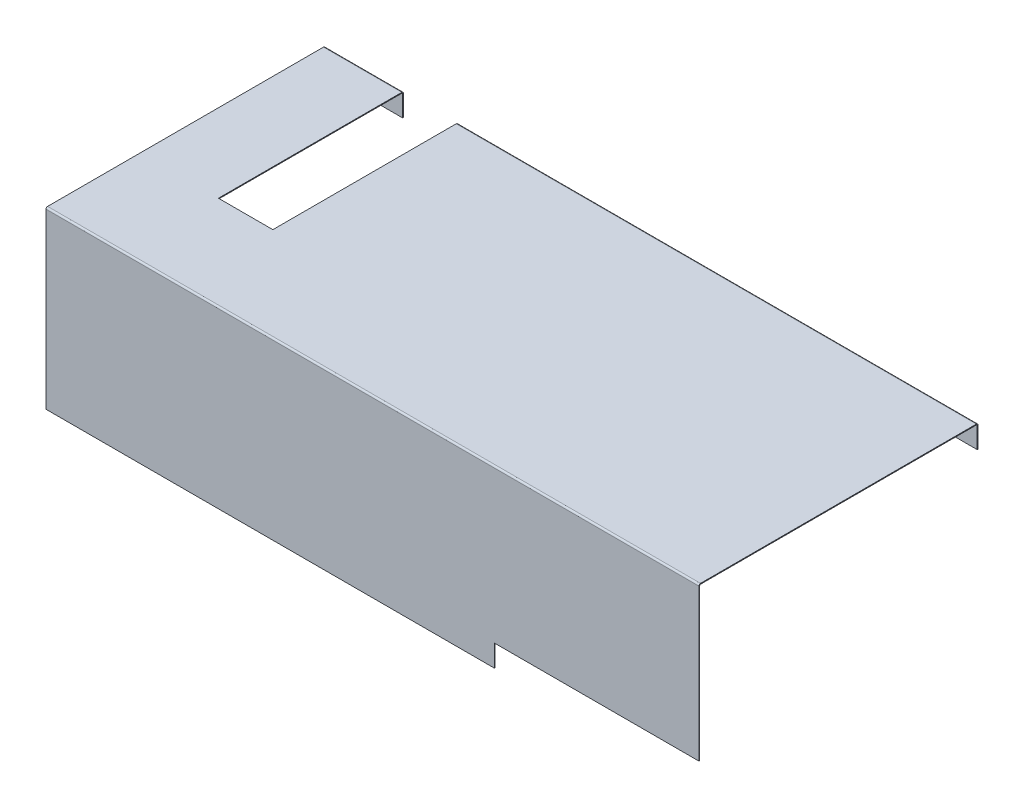
ISO-10303-21;
HEADER;
FILE_DESCRIPTION(('STEP AP214'),'2;1');
FILE_NAME('part.step','',(''),(''),'','','');
FILE_SCHEMA(('AUTOMOTIVE_DESIGN { 1 0 10303 214 1 1 1 1 }'));
ENDSEC;
DATA;
#1=APPLICATION_CONTEXT('core data for automotive mechanical design processes');
#2=APPLICATION_PROTOCOL_DEFINITION('international standard','automotive_design',2000,#1);
#3=PRODUCT_CONTEXT('',#1,'mechanical');
#4=PRODUCT('Part','Part','',(#3));
#5=PRODUCT_RELATED_PRODUCT_CATEGORY('part','',(#4));
#6=PRODUCT_DEFINITION_FORMATION('','',#4);
#7=PRODUCT_DEFINITION_CONTEXT('part definition',#1,'design');
#8=PRODUCT_DEFINITION('design','',#6,#7);
#9=PRODUCT_DEFINITION_SHAPE('','',#8);
#10=(LENGTH_UNIT() NAMED_UNIT(*) SI_UNIT(.MILLI.,.METRE.));
#11=(NAMED_UNIT(*) PLANE_ANGLE_UNIT() SI_UNIT($,.RADIAN.));
#12=(NAMED_UNIT(*) SI_UNIT($,.STERADIAN.) SOLID_ANGLE_UNIT());
#13=UNCERTAINTY_MEASURE_WITH_UNIT(LENGTH_MEASURE(1.E-05),#10,'distance_accuracy_value','');
#14=(GEOMETRIC_REPRESENTATION_CONTEXT(3) GLOBAL_UNCERTAINTY_ASSIGNED_CONTEXT((#13)) GLOBAL_UNIT_ASSIGNED_CONTEXT((#10,
#11,#12)) REPRESENTATION_CONTEXT('',''));
#15=CARTESIAN_POINT('',(0.,0.,0.));
#16=DIRECTION('',(0.,0.,1.));
#17=DIRECTION('',(1.,0.,0.));
#18=AXIS2_PLACEMENT_3D('',#15,#16,#17);
#19=CARTESIAN_POINT('',(122.,-20.,-255.7366));
#20=DIRECTION('',(1.,0.,0.));
#21=DIRECTION('',(0.,0.,-1.));
#22=AXIS2_PLACEMENT_3D('',#19,#20,#21);
#23=PLANE('',#22);
#24=DIRECTION('',(0.,-1.,0.));
#25=VECTOR('',#24,1.);
#26=CARTESIAN_POINT('',(122.,140.,-255.));
#27=LINE('',#26,#25);
#28=CARTESIAN_POINT('',(122.,139.2634,-255.));
#29=VERTEX_POINT('',#28);
#30=CARTESIAN_POINT('',(122.,120.,-255.));
#31=VERTEX_POINT('',#30);
#32=EDGE_CURVE('E226',#29,#31,#27,.T.);
#33=ORIENTED_EDGE('',*,*,#32,.F.);
#34=DIRECTION('',(0.,0.,-1.));
#35=VECTOR('',#34,1.);
#36=CARTESIAN_POINT('',(122.,139.2634,-255.));
#37=LINE('',#36,#35);
#38=CARTESIAN_POINT('',(122.,139.2634,-255.7366));
#39=VERTEX_POINT('',#38);
#40=EDGE_CURVE('E11',#29,#39,#37,.T.);
#41=ORIENTED_EDGE('',*,*,#40,.T.);
#42=DIRECTION('',(0.,1.,0.));
#43=VECTOR('',#42,1.);
#44=CARTESIAN_POINT('',(122.,-20.,-255.7366));
#45=LINE('',#44,#43);
#46=CARTESIAN_POINT('',(122.,120.,-255.7366));
#47=VERTEX_POINT('',#46);
#48=EDGE_CURVE('E220',#47,#39,#45,.T.);
#49=ORIENTED_EDGE('',*,*,#48,.F.);
#50=DIRECTION('',(0.,0.,1.));
#51=VECTOR('',#50,1.);
#52=CARTESIAN_POINT('',(122.,120.,-255.7366));
#53=LINE('',#52,#51);
#54=EDGE_CURVE('E229',#47,#31,#53,.T.);
#55=ORIENTED_EDGE('',*,*,#54,.T.);
#56=EDGE_LOOP('',(#33,#41,#49,#55));
#57=FACE_BOUND('',#56,.T.);
#58=ADVANCED_FACE('F39',(#57),#23,.F.);
#59=DIRECTION('',(0.,0.,-1.));
#60=VECTOR('',#59,1.);
#61=CARTESIAN_POINT('',(122.,140.7366,-255.7366));
#62=LINE('',#61,#60);
#63=CARTESIAN_POINT('',(122.,140.7366,-85.7366));
#64=VERTEX_POINT('',#63);
#65=CARTESIAN_POINT('',(122.,140.7366,-254.2634));
#66=VERTEX_POINT('',#65);
#67=EDGE_CURVE('E200',#64,#66,#62,.T.);
#68=ORIENTED_EDGE('',*,*,#67,.T.);
#69=DIRECTION('',(0.,-1.,0.));
#70=VECTOR('',#69,1.);
#71=CARTESIAN_POINT('',(122.,140.7366,-254.2634));
#72=LINE('',#71,#70);
#73=CARTESIAN_POINT('',(122.,140.,-254.2634));
#74=VERTEX_POINT('',#73);
#75=EDGE_CURVE('E47',#66,#74,#72,.T.);
#76=ORIENTED_EDGE('',*,*,#75,.T.);
#77=DIRECTION('',(0.,0.,-1.));
#78=VECTOR('',#77,1.);
#79=CARTESIAN_POINT('',(122.,140.,0.));
#80=LINE('',#79,#78);
#81=CARTESIAN_POINT('',(122.,140.,-85.7366));
#82=VERTEX_POINT('',#81);
#83=EDGE_CURVE('E219',#82,#74,#80,.T.);
#84=ORIENTED_EDGE('',*,*,#83,.F.);
#85=DIRECTION('',(0.,1.,0.));
#86=VECTOR('',#85,1.);
#87=CARTESIAN_POINT('',(122.,-20.,-85.7366));
#88=LINE('',#87,#86);
#89=EDGE_CURVE('E199',#82,#64,#88,.T.);
#90=ORIENTED_EDGE('',*,*,#89,.T.);
#91=EDGE_LOOP('',(#68,#76,#84,#90));
#92=FACE_BOUND('',#91,.T.);
#93=ADVANCED_FACE('F394',(#92),#23,.F.);
#94=CARTESIAN_POINT('',(72.,-20.,-255.7366));
#95=DIRECTION('',(-1.,0.,0.));
#96=DIRECTION('',(0.,0.,1.));
#97=AXIS2_PLACEMENT_3D('',#94,#95,#96);
#98=PLANE('',#97);
#99=DIRECTION('',(0.,0.,1.));
#100=VECTOR('',#99,1.);
#101=CARTESIAN_POINT('',(72.0000000000001,140.,2.15513881250766E-13));
#102=LINE('',#101,#100);
#103=CARTESIAN_POINT('',(72.,140.,-254.2634));
#104=VERTEX_POINT('',#103);
#105=CARTESIAN_POINT('',(72.,140.,-85.7366));
#106=VERTEX_POINT('',#105);
#107=EDGE_CURVE('E233',#104,#106,#102,.T.);
#108=ORIENTED_EDGE('',*,*,#107,.F.);
#109=DIRECTION('',(0.,1.,0.));
#110=VECTOR('',#109,1.);
#111=CARTESIAN_POINT('',(72.,140.,-254.2634));
#112=LINE('',#111,#110);
#113=CARTESIAN_POINT('',(72.,140.7366,-254.2634));
#114=VERTEX_POINT('',#113);
#115=EDGE_CURVE('E205',#104,#114,#112,.T.);
#116=ORIENTED_EDGE('',*,*,#115,.T.);
#117=DIRECTION('',(0.,0.,1.));
#118=VECTOR('',#117,1.);
#119=CARTESIAN_POINT('',(72.,140.7366,-255.7366));
#120=LINE('',#119,#118);
#121=CARTESIAN_POINT('',(72.,140.7366,-85.7366));
#122=VERTEX_POINT('',#121);
#123=EDGE_CURVE('E203',#114,#122,#120,.T.);
#124=ORIENTED_EDGE('',*,*,#123,.T.);
#125=DIRECTION('',(0.,1.,0.));
#126=VECTOR('',#125,1.);
#127=CARTESIAN_POINT('',(72.,-20.,-85.7366));
#128=LINE('',#127,#126);
#129=EDGE_CURVE('E187',#106,#122,#128,.T.);
#130=ORIENTED_EDGE('',*,*,#129,.F.);
#131=EDGE_LOOP('',(#108,#116,#124,#130));
#132=FACE_BOUND('',#131,.T.);
#133=ADVANCED_FACE('F204',(#132),#98,.F.);
#134=DIRECTION('',(0.,1.,0.));
#135=VECTOR('',#134,1.);
#136=CARTESIAN_POINT('',(72.,-20.,-255.7366));
#137=LINE('',#136,#135);
#138=CARTESIAN_POINT('',(72.,120.,-255.7366));
#139=VERTEX_POINT('',#138);
#140=CARTESIAN_POINT('',(72.,139.2634,-255.7366));
#141=VERTEX_POINT('',#140);
#142=EDGE_CURVE('E216',#139,#141,#137,.T.);
#143=ORIENTED_EDGE('',*,*,#142,.T.);
#144=DIRECTION('',(0.,0.,1.));
#145=VECTOR('',#144,1.);
#146=CARTESIAN_POINT('',(72.,139.2634,-255.7366));
#147=LINE('',#146,#145);
#148=CARTESIAN_POINT('',(72.,139.2634,-255.));
#149=VERTEX_POINT('',#148);
#150=EDGE_CURVE('E391',#141,#149,#147,.T.);
#151=ORIENTED_EDGE('',*,*,#150,.T.);
#152=DIRECTION('',(0.,1.,0.));
#153=VECTOR('',#152,1.);
#154=CARTESIAN_POINT('',(72.,140.,-255.));
#155=LINE('',#154,#153);
#156=CARTESIAN_POINT('',(72.,120.,-255.));
#157=VERTEX_POINT('',#156);
#158=EDGE_CURVE('E235',#157,#149,#155,.T.);
#159=ORIENTED_EDGE('',*,*,#158,.F.);
#160=DIRECTION('',(0.,0.,-1.));
#161=VECTOR('',#160,1.);
#162=CARTESIAN_POINT('',(72.,120.,-255.7366));
#163=LINE('',#162,#161);
#164=EDGE_CURVE('E238',#157,#139,#163,.T.);
#165=ORIENTED_EDGE('',*,*,#164,.T.);
#166=EDGE_LOOP('',(#143,#151,#159,#165));
#167=FACE_BOUND('',#166,.T.);
#168=ADVANCED_FACE('F454',(#167),#98,.F.);
#169=CARTESIAN_POINT('',(600.,140.,-255.));
#170=DIRECTION('',(0.,0.,-1.));
#171=DIRECTION('',(-1.,0.,0.));
#172=AXIS2_PLACEMENT_3D('',#169,#170,#171);
#173=PLANE('',#172);
#174=DIRECTION('',(-1.,0.,0.));
#175=VECTOR('',#174,1.);
#176=CARTESIAN_POINT('',(600.,120.,-255.));
#177=LINE('',#176,#175);
#178=CARTESIAN_POINT('',(0.,120.,-255.));
#179=VERTEX_POINT('',#178);
#180=EDGE_CURVE('E362',#157,#179,#177,.T.);
#181=ORIENTED_EDGE('',*,*,#180,.F.);
#182=ORIENTED_EDGE('',*,*,#158,.T.);
#183=DIRECTION('',(-1.,0.,0.));
#184=VECTOR('',#183,1.);
#185=CARTESIAN_POINT('',(600.,139.2634,-255.));
#186=LINE('',#185,#184);
#187=CARTESIAN_POINT('',(0.,139.2634,-255.));
#188=VERTEX_POINT('',#187);
#189=EDGE_CURVE('E296',#149,#188,#186,.T.);
#190=ORIENTED_EDGE('',*,*,#189,.T.);
#191=DIRECTION('',(0.,-1.,0.));
#192=VECTOR('',#191,1.);
#193=CARTESIAN_POINT('',(0.,140.,-255.));
#194=LINE('',#193,#192);
#195=EDGE_CURVE('E259',#188,#179,#194,.T.);
#196=ORIENTED_EDGE('',*,*,#195,.T.);
#197=EDGE_LOOP('',(#181,#182,#190,#196));
#198=FACE_BOUND('',#197,.T.);
#199=ADVANCED_FACE('F446',(#198),#173,.F.);
#200=CARTESIAN_POINT('',(600.,120.,-255.7366));
#201=DIRECTION('',(0.,-1.,0.));
#202=DIRECTION('',(0.,0.,-1.));
#203=AXIS2_PLACEMENT_3D('',#200,#201,#202);
#204=PLANE('',#203);
#205=ORIENTED_EDGE('',*,*,#164,.F.);
#206=ORIENTED_EDGE('',*,*,#180,.T.);
#207=DIRECTION('',(0.,0.,1.));
#208=VECTOR('',#207,1.);
#209=CARTESIAN_POINT('',(0.,120.,-255.7366));
#210=LINE('',#209,#208);
#211=CARTESIAN_POINT('',(0.,120.,-255.7366));
#212=VERTEX_POINT('',#211);
#213=EDGE_CURVE('E299',#212,#179,#210,.T.);
#214=ORIENTED_EDGE('',*,*,#213,.F.);
#215=DIRECTION('',(-1.,0.,0.));
#216=VECTOR('',#215,1.);
#217=CARTESIAN_POINT('',(600.,120.,-255.7366));
#218=LINE('',#217,#216);
#219=EDGE_CURVE('E358',#139,#212,#218,.T.);
#220=ORIENTED_EDGE('',*,*,#219,.F.);
#221=EDGE_LOOP('',(#205,#206,#214,#220));
#222=FACE_BOUND('',#221,.T.);
#223=ADVANCED_FACE('F443',(#222),#204,.T.);
#224=CARTESIAN_POINT('',(600.,140.,-255.7366));
#225=DIRECTION('',(0.,0.,-1.));
#226=DIRECTION('',(-1.,0.,0.));
#227=AXIS2_PLACEMENT_3D('',#224,#225,#226);
#228=PLANE('',#227);
#229=ORIENTED_EDGE('',*,*,#142,.F.);
#230=ORIENTED_EDGE('',*,*,#219,.T.);
#231=DIRECTION('',(0.,1.,0.));
#232=VECTOR('',#231,1.);
#233=CARTESIAN_POINT('',(0.,140.,-255.7366));
#234=LINE('',#233,#232);
#235=CARTESIAN_POINT('',(0.,139.2634,-255.7366));
#236=VERTEX_POINT('',#235);
#237=EDGE_CURVE('E302',#236,#212,#234,.F.);
#238=ORIENTED_EDGE('',*,*,#237,.F.);
#239=DIRECTION('',(-1.,0.,0.));
#240=VECTOR('',#239,1.);
#241=CARTESIAN_POINT('',(600.,139.2634,-255.7366));
#242=LINE('',#241,#240);
#243=EDGE_CURVE('E354',#141,#236,#242,.T.);
#244=ORIENTED_EDGE('',*,*,#243,.F.);
#245=EDGE_LOOP('',(#229,#230,#238,#244));
#246=FACE_BOUND('',#245,.T.);
#247=ADVANCED_FACE('F438',(#246),#228,.T.);
#248=CARTESIAN_POINT('',(600.,139.2634,-254.2634));
#249=DIRECTION('',(-1.,0.,0.));
#250=DIRECTION('',(0.,0.,1.));
#251=AXIS2_PLACEMENT_3D('',#248,#249,#250);
#252=CYLINDRICAL_SURFACE('',#251,1.4732);
#253=CARTESIAN_POINT('',(72.,139.2634,-254.2634));
#254=DIRECTION('',(-1.,0.,0.));
#255=DIRECTION('',(0.,0.,1.));
#256=AXIS2_PLACEMENT_3D('',#253,#254,#255);
#257=CIRCLE('',#256,1.4732);
#258=EDGE_CURVE('E240',#141,#114,#257,.F.);
#259=ORIENTED_EDGE('',*,*,#258,.F.);
#260=ORIENTED_EDGE('',*,*,#243,.T.);
#261=CARTESIAN_POINT('',(0.,139.2634,-254.2634));
#262=DIRECTION('',(1.,0.,0.));
#263=DIRECTION('',(0.,0.,-1.));
#264=AXIS2_PLACEMENT_3D('',#261,#262,#263);
#265=CIRCLE('',#264,1.4732);
#266=CARTESIAN_POINT('',(0.,140.7366,-254.2634));
#267=VERTEX_POINT('',#266);
#268=EDGE_CURVE('E305',#267,#236,#265,.F.);
#269=ORIENTED_EDGE('',*,*,#268,.F.);
#270=DIRECTION('',(-1.,0.,0.));
#271=VECTOR('',#270,1.);
#272=CARTESIAN_POINT('',(600.,140.7366,-254.2634));
#273=LINE('',#272,#271);
#274=EDGE_CURVE('E351',#114,#267,#273,.T.);
#275=ORIENTED_EDGE('',*,*,#274,.F.);
#276=EDGE_LOOP('',(#259,#260,#269,#275));
#277=FACE_BOUND('',#276,.T.);
#278=ADVANCED_FACE('F430',(#277),#252,.T.);
#279=CARTESIAN_POINT('',(600.,139.2634,-254.2634));
#280=DIRECTION('',(-1.,0.,0.));
#281=DIRECTION('',(0.,0.,1.));
#282=AXIS2_PLACEMENT_3D('',#279,#280,#281);
#283=CYLINDRICAL_SURFACE('',#282,0.7366);
#284=ORIENTED_EDGE('',*,*,#189,.F.);
#285=CARTESIAN_POINT('',(72.,139.2634,-254.2634));
#286=DIRECTION('',(-1.,0.,0.));
#287=DIRECTION('',(0.,0.,1.));
#288=AXIS2_PLACEMENT_3D('',#285,#286,#287);
#289=CIRCLE('',#288,0.7366);
#290=EDGE_CURVE('E387',#149,#104,#289,.F.);
#291=ORIENTED_EDGE('',*,*,#290,.T.);
#292=DIRECTION('',(-1.,0.,0.));
#293=VECTOR('',#292,1.);
#294=CARTESIAN_POINT('',(600.,140.,-254.2634));
#295=LINE('',#294,#293);
#296=CARTESIAN_POINT('',(0.,140.,-254.2634));
#297=VERTEX_POINT('',#296);
#298=EDGE_CURVE('E331',#104,#297,#295,.T.);
#299=ORIENTED_EDGE('',*,*,#298,.T.);
#300=CARTESIAN_POINT('',(0.,139.2634,-254.2634));
#301=DIRECTION('',(1.,0.,0.));
#302=DIRECTION('',(0.,0.,-1.));
#303=AXIS2_PLACEMENT_3D('',#300,#301,#302);
#304=CIRCLE('',#303,0.7366);
#305=EDGE_CURVE('E263',#297,#188,#304,.F.);
#306=ORIENTED_EDGE('',*,*,#305,.T.);
#307=EDGE_LOOP('',(#284,#291,#299,#306));
#308=FACE_BOUND('',#307,.T.);
#309=ADVANCED_FACE('F449',(#308),#283,.F.);
#310=CARTESIAN_POINT('',(600.,139.2634,0.));
#311=DIRECTION('',(1.,0.,0.));
#312=DIRECTION('',(0.,0.,-1.));
#313=AXIS2_PLACEMENT_3D('',#310,#311,#312);
#314=PLANE('',#313);
#315=DIRECTION('',(0.,0.,1.));
#316=VECTOR('',#315,1.);
#317=CARTESIAN_POINT('',(600.,139.2634,0.));
#318=LINE('',#317,#316);
#319=CARTESIAN_POINT('',(600.,139.2634,0.));
#320=VERTEX_POINT('',#319);
#321=CARTESIAN_POINT('',(600.,139.2634,0.7366));
#322=VERTEX_POINT('',#321);
#323=EDGE_CURVE('E382',#320,#322,#318,.T.);
#324=ORIENTED_EDGE('',*,*,#323,.F.);
#325=CARTESIAN_POINT('',(600.,139.2634,-0.7366));
#326=DIRECTION('',(1.,0.,0.));
#327=DIRECTION('',(0.,0.,-1.));
#328=AXIS2_PLACEMENT_3D('',#325,#326,#327);
#329=CIRCLE('',#328,0.7366);
#330=CARTESIAN_POINT('',(600.,140.,-0.7366));
#331=VERTEX_POINT('',#330);
#332=EDGE_CURVE('E287',#320,#331,#329,.F.);
#333=ORIENTED_EDGE('',*,*,#332,.T.);
#334=DIRECTION('',(0.,-1.,0.));
#335=VECTOR('',#334,1.);
#336=CARTESIAN_POINT('',(600.,140.7366,-0.7366));
#337=LINE('',#336,#335);
#338=CARTESIAN_POINT('',(600.,140.7366,-0.7366));
#339=VERTEX_POINT('',#338);
#340=EDGE_CURVE('E380',#339,#331,#337,.T.);
#341=ORIENTED_EDGE('',*,*,#340,.F.);
#342=CARTESIAN_POINT('',(600.,139.2634,-0.7366));
#343=DIRECTION('',(1.,0.,0.));
#344=DIRECTION('',(0.,0.,-1.));
#345=AXIS2_PLACEMENT_3D('',#342,#343,#344);
#346=CIRCLE('',#345,1.4732);
#347=EDGE_CURVE('E275',#322,#339,#346,.F.);
#348=ORIENTED_EDGE('',*,*,#347,.F.);
#349=EDGE_LOOP('',(#324,#333,#341,#348));
#350=FACE_BOUND('',#349,.T.);
#351=ADVANCED_FACE('F41',(#350),#314,.T.);
#352=CARTESIAN_POINT('',(600.,140.7366,-0.7366));
#353=DIRECTION('',(1.,0.,0.));
#354=DIRECTION('',(0.,0.,-1.));
#355=AXIS2_PLACEMENT_3D('',#352,#353,#354);
#356=PLANE('',#355);
#357=DIRECTION('',(0.,1.,0.));
#358=VECTOR('',#357,1.);
#359=CARTESIAN_POINT('',(600.,0.,0.));
#360=LINE('',#359,#358);
#361=CARTESIAN_POINT('',(600.,0.,0.));
#362=VERTEX_POINT('',#361);
#363=EDGE_CURVE('E284',#362,#320,#360,.T.);
#364=ORIENTED_EDGE('',*,*,#363,.T.);
#365=ORIENTED_EDGE('',*,*,#323,.T.);
#366=DIRECTION('',(0.,1.,0.));
#367=VECTOR('',#366,1.);
#368=CARTESIAN_POINT('',(600.,0.,0.7366));
#369=LINE('',#368,#367);
#370=CARTESIAN_POINT('',(600.,0.,0.7366));
#371=VERTEX_POINT('',#370);
#372=EDGE_CURVE('E278',#371,#322,#369,.T.);
#373=ORIENTED_EDGE('',*,*,#372,.F.);
#374=DIRECTION('',(0.,0.,1.));
#375=VECTOR('',#374,1.);
#376=CARTESIAN_POINT('',(600.,0.,0.));
#377=LINE('',#376,#375);
#378=EDGE_CURVE('E281',#362,#371,#377,.T.);
#379=ORIENTED_EDGE('',*,*,#378,.F.);
#380=EDGE_LOOP('',(#364,#365,#373,#379));
#381=FACE_BOUND('',#380,.T.);
#382=ADVANCED_FACE('F639',(#381),#356,.T.);
#383=CARTESIAN_POINT('',(0.,140.,-0.7366));
#384=DIRECTION('',(-1.,0.,0.));
#385=DIRECTION('',(0.,0.,1.));
#386=AXIS2_PLACEMENT_3D('',#383,#384,#385);
#387=PLANE('',#386);
#388=DIRECTION('',(0.,1.,0.));
#389=VECTOR('',#388,1.);
#390=CARTESIAN_POINT('',(0.,140.,-0.7366));
#391=LINE('',#390,#389);
#392=CARTESIAN_POINT('',(0.,140.,-0.7366));
#393=VERTEX_POINT('',#392);
#394=CARTESIAN_POINT('',(0.,140.7366,-0.7366));
#395=VERTEX_POINT('',#394);
#396=EDGE_CURVE('E378',#393,#395,#391,.T.);
#397=ORIENTED_EDGE('',*,*,#396,.F.);
#398=CARTESIAN_POINT('',(0.,139.2634,-0.7366));
#399=DIRECTION('',(1.,0.,0.));
#400=DIRECTION('',(0.,0.,-1.));
#401=AXIS2_PLACEMENT_3D('',#398,#399,#400);
#402=CIRCLE('',#401,0.7366);
#403=CARTESIAN_POINT('',(0.,139.2634,0.));
#404=VERTEX_POINT('',#403);
#405=EDGE_CURVE('E320',#404,#393,#402,.F.);
#406=ORIENTED_EDGE('',*,*,#405,.F.);
#407=DIRECTION('',(0.,0.,-1.));
#408=VECTOR('',#407,1.);
#409=CARTESIAN_POINT('',(0.,139.2634,0.7366));
#410=LINE('',#409,#408);
#411=CARTESIAN_POINT('',(0.,139.2634,0.7366));
#412=VERTEX_POINT('',#411);
#413=EDGE_CURVE('E376',#412,#404,#410,.T.);
#414=ORIENTED_EDGE('',*,*,#413,.F.);
#415=CARTESIAN_POINT('',(0.,139.2634,-0.7366));
#416=DIRECTION('',(1.,0.,0.));
#417=DIRECTION('',(0.,0.,-1.));
#418=AXIS2_PLACEMENT_3D('',#415,#416,#417);
#419=CIRCLE('',#418,1.4732);
#420=EDGE_CURVE('E311',#412,#395,#419,.F.);
#421=ORIENTED_EDGE('',*,*,#420,.T.);
#422=EDGE_LOOP('',(#397,#406,#414,#421));
#423=FACE_BOUND('',#422,.T.);
#424=ADVANCED_FACE('F632',(#423),#387,.T.);
#425=CARTESIAN_POINT('',(0.,139.2634,0.7366));
#426=DIRECTION('',(-1.,0.,0.));
#427=DIRECTION('',(0.,0.,1.));
#428=AXIS2_PLACEMENT_3D('',#425,#426,#427);
#429=PLANE('',#428);
#430=DIRECTION('',(0.,0.,-1.));
#431=VECTOR('',#430,1.);
#432=CARTESIAN_POINT('',(0.,140.,0.));
#433=LINE('',#432,#431);
#434=EDGE_CURVE('E323',#393,#297,#433,.T.);
#435=ORIENTED_EDGE('',*,*,#434,.F.);
#436=ORIENTED_EDGE('',*,*,#396,.T.);
#437=DIRECTION('',(0.,0.,-1.));
#438=VECTOR('',#437,1.);
#439=CARTESIAN_POINT('',(0.,140.7366,0.));
#440=LINE('',#439,#438);
#441=EDGE_CURVE('E308',#395,#267,#440,.T.);
#442=ORIENTED_EDGE('',*,*,#441,.T.);
#443=DIRECTION('',(0.,-1.,0.));
#444=VECTOR('',#443,1.);
#445=CARTESIAN_POINT('',(0.,140.7366,-254.2634));
#446=LINE('',#445,#444);
#447=EDGE_CURVE('E366',#267,#297,#446,.T.);
#448=ORIENTED_EDGE('',*,*,#447,.T.);
#449=EDGE_LOOP('',(#435,#436,#442,#448));
#450=FACE_BOUND('',#449,.T.);
#451=ADVANCED_FACE('F421',(#450),#429,.T.);
#452=CARTESIAN_POINT('',(600.,140.,-254.2634));
#453=DIRECTION('',(1.,0.,0.));
#454=DIRECTION('',(0.,0.,-1.));
#455=AXIS2_PLACEMENT_3D('',#452,#453,#454);
#456=PLANE('',#455);
#457=DIRECTION('',(0.,1.,0.));
#458=VECTOR('',#457,1.);
#459=CARTESIAN_POINT('',(600.,140.,-254.2634));
#460=LINE('',#459,#458);
#461=CARTESIAN_POINT('',(600.,140.,-254.2634));
#462=VERTEX_POINT('',#461);
#463=CARTESIAN_POINT('',(600.,140.7366,-254.2634));
#464=VERTEX_POINT('',#463);
#465=EDGE_CURVE('E374',#462,#464,#460,.T.);
#466=ORIENTED_EDGE('',*,*,#465,.F.);
#467=CARTESIAN_POINT('',(600.,139.2634,-254.2634));
#468=DIRECTION('',(1.,0.,0.));
#469=DIRECTION('',(0.,0.,-1.));
#470=AXIS2_PLACEMENT_3D('',#467,#468,#469);
#471=CIRCLE('',#470,0.7366);
#472=CARTESIAN_POINT('',(600.,139.2634,-255.));
#473=VERTEX_POINT('',#472);
#474=EDGE_CURVE('E293',#462,#473,#471,.F.);
#475=ORIENTED_EDGE('',*,*,#474,.T.);
#476=DIRECTION('',(0.,0.,1.));
#477=VECTOR('',#476,1.);
#478=CARTESIAN_POINT('',(600.,139.2634,-255.7366));
#479=LINE('',#478,#477);
#480=CARTESIAN_POINT('',(600.,139.2634,-255.7366));
#481=VERTEX_POINT('',#480);
#482=EDGE_CURVE('E372',#481,#473,#479,.T.);
#483=ORIENTED_EDGE('',*,*,#482,.F.);
#484=CARTESIAN_POINT('',(600.,139.2634,-254.2634));
#485=DIRECTION('',(1.,0.,0.));
#486=DIRECTION('',(0.,0.,-1.));
#487=AXIS2_PLACEMENT_3D('',#484,#485,#486);
#488=CIRCLE('',#487,1.4732);
#489=EDGE_CURVE('E269',#464,#481,#488,.F.);
#490=ORIENTED_EDGE('',*,*,#489,.F.);
#491=EDGE_LOOP('',(#466,#475,#483,#490));
#492=FACE_BOUND('',#491,.T.);
#493=ADVANCED_FACE('F408',(#492),#456,.T.);
#494=CARTESIAN_POINT('',(600.,139.2634,-255.7366));
#495=DIRECTION('',(1.,0.,0.));
#496=DIRECTION('',(0.,0.,-1.));
#497=AXIS2_PLACEMENT_3D('',#494,#495,#496);
#498=PLANE('',#497);
#499=DIRECTION('',(0.,0.,-1.));
#500=VECTOR('',#499,1.);
#501=CARTESIAN_POINT('',(600.,140.,0.));
#502=LINE('',#501,#500);
#503=EDGE_CURVE('E290',#331,#462,#502,.T.);
#504=ORIENTED_EDGE('',*,*,#503,.T.);
#505=ORIENTED_EDGE('',*,*,#465,.T.);
#506=DIRECTION('',(0.,0.,-1.));
#507=VECTOR('',#506,1.);
#508=CARTESIAN_POINT('',(600.,140.7366,0.));
#509=LINE('',#508,#507);
#510=EDGE_CURVE('E272',#339,#464,#509,.T.);
#511=ORIENTED_EDGE('',*,*,#510,.F.);
#512=ORIENTED_EDGE('',*,*,#340,.T.);
#513=EDGE_LOOP('',(#504,#505,#511,#512));
#514=FACE_BOUND('',#513,.T.);
#515=ADVANCED_FACE('F414',(#514),#498,.T.);
#516=CARTESIAN_POINT('',(0.,139.2634,-255.));
#517=DIRECTION('',(-1.,0.,0.));
#518=DIRECTION('',(0.,0.,1.));
#519=AXIS2_PLACEMENT_3D('',#516,#517,#518);
#520=PLANE('',#519);
#521=DIRECTION('',(0.,0.,-1.));
#522=VECTOR('',#521,1.);
#523=CARTESIAN_POINT('',(0.,139.2634,-255.));
#524=LINE('',#523,#522);
#525=EDGE_CURVE('E369',#188,#236,#524,.T.);
#526=ORIENTED_EDGE('',*,*,#525,.F.);
#527=ORIENTED_EDGE('',*,*,#305,.F.);
#528=ORIENTED_EDGE('',*,*,#447,.F.);
#529=ORIENTED_EDGE('',*,*,#268,.T.);
#530=EDGE_LOOP('',(#526,#527,#528,#529));
#531=FACE_BOUND('',#530,.T.);
#532=ADVANCED_FACE('F427',(#531),#520,.T.);
#533=CARTESIAN_POINT('',(0.,140.7366,-254.2634));
#534=DIRECTION('',(-1.,0.,0.));
#535=DIRECTION('',(0.,0.,1.));
#536=AXIS2_PLACEMENT_3D('',#533,#534,#535);
#537=PLANE('',#536);
#538=ORIENTED_EDGE('',*,*,#195,.F.);
#539=ORIENTED_EDGE('',*,*,#525,.T.);
#540=ORIENTED_EDGE('',*,*,#237,.T.);
#541=ORIENTED_EDGE('',*,*,#213,.T.);
#542=EDGE_LOOP('',(#538,#539,#540,#541));
#543=FACE_BOUND('',#542,.T.);
#544=ADVANCED_FACE('F437',(#543),#537,.T.);
#545=EDGE_CURVE('E328',#473,#29,#186,.T.);
#546=ORIENTED_EDGE('',*,*,#545,.T.);
#547=ORIENTED_EDGE('',*,*,#32,.T.);
#548=CARTESIAN_POINT('',(600.,120.,-255.));
#549=VERTEX_POINT('',#548);
#550=EDGE_CURVE('E363',#549,#31,#177,.T.);
#551=ORIENTED_EDGE('',*,*,#550,.F.);
#552=DIRECTION('',(0.,-1.,0.));
#553=VECTOR('',#552,1.);
#554=CARTESIAN_POINT('',(600.,140.,-255.));
#555=LINE('',#554,#553);
#556=EDGE_CURVE('E260',#473,#549,#555,.T.);
#557=ORIENTED_EDGE('',*,*,#556,.F.);
#558=EDGE_LOOP('',(#546,#547,#551,#557));
#559=FACE_BOUND('',#558,.T.);
#560=ADVANCED_FACE('F462',(#559),#173,.F.);
#561=ORIENTED_EDGE('',*,*,#54,.F.);
#562=CARTESIAN_POINT('',(600.,120.,-255.7366));
#563=VERTEX_POINT('',#562);
#564=EDGE_CURVE('E359',#563,#47,#218,.T.);
#565=ORIENTED_EDGE('',*,*,#564,.F.);
#566=DIRECTION('',(0.,0.,1.));
#567=VECTOR('',#566,1.);
#568=CARTESIAN_POINT('',(600.,120.,-255.7366));
#569=LINE('',#568,#567);
#570=EDGE_CURVE('E262',#563,#549,#569,.T.);
#571=ORIENTED_EDGE('',*,*,#570,.T.);
#572=ORIENTED_EDGE('',*,*,#550,.T.);
#573=EDGE_LOOP('',(#561,#565,#571,#572));
#574=FACE_BOUND('',#573,.T.);
#575=ADVANCED_FACE('F587',(#574),#204,.T.);
#576=ORIENTED_EDGE('',*,*,#48,.T.);
#577=EDGE_CURVE('E355',#481,#39,#242,.T.);
#578=ORIENTED_EDGE('',*,*,#577,.F.);
#579=DIRECTION('',(0.,1.,0.));
#580=VECTOR('',#579,1.);
#581=CARTESIAN_POINT('',(600.,140.,-255.7366));
#582=LINE('',#581,#580);
#583=EDGE_CURVE('E266',#481,#563,#582,.F.);
#584=ORIENTED_EDGE('',*,*,#583,.T.);
#585=ORIENTED_EDGE('',*,*,#564,.T.);
#586=EDGE_LOOP('',(#576,#578,#584,#585));
#587=FACE_BOUND('',#586,.T.);
#588=ADVANCED_FACE('F579',(#587),#228,.T.);
#589=CARTESIAN_POINT('',(122.,139.2634,-254.2634));
#590=DIRECTION('',(1.,0.,0.));
#591=DIRECTION('',(0.,0.,-1.));
#592=AXIS2_PLACEMENT_3D('',#589,#590,#591);
#593=CIRCLE('',#592,1.4732);
#594=EDGE_CURVE('E231',#66,#39,#593,.F.);
#595=ORIENTED_EDGE('',*,*,#594,.F.);
#596=EDGE_CURVE('E352',#464,#66,#273,.T.);
#597=ORIENTED_EDGE('',*,*,#596,.F.);
#598=ORIENTED_EDGE('',*,*,#489,.T.);
#599=ORIENTED_EDGE('',*,*,#577,.T.);
#600=EDGE_LOOP('',(#595,#597,#598,#599));
#601=FACE_BOUND('',#600,.T.);
#602=ADVANCED_FACE('F572',(#601),#252,.T.);
#603=CARTESIAN_POINT('',(600.,140.7366,0.));
#604=DIRECTION('',(0.,1.,0.));
#605=DIRECTION('',(0.,0.,1.));
#606=AXIS2_PLACEMENT_3D('',#603,#604,#605);
#607=PLANE('',#606);
#608=ORIENTED_EDGE('',*,*,#123,.F.);
#609=ORIENTED_EDGE('',*,*,#274,.T.);
#610=ORIENTED_EDGE('',*,*,#441,.F.);
#611=DIRECTION('',(-1.,0.,0.));
#612=VECTOR('',#611,1.);
#613=CARTESIAN_POINT('',(600.,140.7366,-0.7366));
#614=LINE('',#613,#612);
#615=EDGE_CURVE('E348',#339,#395,#614,.T.);
#616=ORIENTED_EDGE('',*,*,#615,.F.);
#617=ORIENTED_EDGE('',*,*,#510,.T.);
#618=ORIENTED_EDGE('',*,*,#596,.T.);
#619=ORIENTED_EDGE('',*,*,#67,.F.);
#620=DIRECTION('',(1.,0.,0.));
#621=VECTOR('',#620,1.);
#622=CARTESIAN_POINT('',(72.,140.7366,-85.7366));
#623=LINE('',#622,#621);
#624=EDGE_CURVE('E192',#122,#64,#623,.T.);
#625=ORIENTED_EDGE('',*,*,#624,.F.);
#626=EDGE_LOOP('',(#608,#609,#610,#616,#617,#618,#619,#625));
#627=FACE_BOUND('',#626,.T.);
#628=ADVANCED_FACE('F210',(#627),#607,.T.);
#629=CARTESIAN_POINT('',(600.,139.2634,-0.7366));
#630=DIRECTION('',(-1.,0.,0.));
#631=DIRECTION('',(0.,0.,1.));
#632=AXIS2_PLACEMENT_3D('',#629,#630,#631);
#633=CYLINDRICAL_SURFACE('',#632,1.4732);
#634=ORIENTED_EDGE('',*,*,#420,.F.);
#635=DIRECTION('',(-1.,0.,0.));
#636=VECTOR('',#635,1.);
#637=CARTESIAN_POINT('',(600.,139.2634,0.7366));
#638=LINE('',#637,#636);
#639=EDGE_CURVE('E345',#322,#412,#638,.T.);
#640=ORIENTED_EDGE('',*,*,#639,.F.);
#641=ORIENTED_EDGE('',*,*,#347,.T.);
#642=ORIENTED_EDGE('',*,*,#615,.T.);
#643=EDGE_LOOP('',(#634,#640,#641,#642));
#644=FACE_BOUND('',#643,.T.);
#645=ADVANCED_FACE('F558',(#644),#633,.T.);
#646=CARTESIAN_POINT('',(600.,0.,0.7366));
#647=DIRECTION('',(0.,0.,1.));
#648=DIRECTION('',(1.,0.,0.));
#649=AXIS2_PLACEMENT_3D('',#646,#647,#648);
#650=PLANE('',#649);
#651=DIRECTION('',(0.,1.,0.));
#652=VECTOR('',#651,1.);
#653=CARTESIAN_POINT('',(0.,0.,0.7366));
#654=LINE('',#653,#652);
#655=CARTESIAN_POINT('',(0.,-20.,0.7366));
#656=VERTEX_POINT('',#655);
#657=EDGE_CURVE('E314',#656,#412,#654,.T.);
#658=ORIENTED_EDGE('',*,*,#657,.F.);
#659=DIRECTION('',(1.,0.,0.));
#660=VECTOR('',#659,1.);
#661=CARTESIAN_POINT('',(0.,-20.,0.7366));
#662=LINE('',#661,#660);
#663=CARTESIAN_POINT('',(412.,-20.,0.7366));
#664=VERTEX_POINT('',#663);
#665=EDGE_CURVE('E242',#656,#664,#662,.T.);
#666=ORIENTED_EDGE('',*,*,#665,.T.);
#667=DIRECTION('',(0.,1.,0.));
#668=VECTOR('',#667,1.);
#669=CARTESIAN_POINT('',(412.,0.,0.7366));
#670=LINE('',#669,#668);
#671=CARTESIAN_POINT('',(412.,0.,0.7366));
#672=VERTEX_POINT('',#671);
#673=EDGE_CURVE('E248',#664,#672,#670,.T.);
#674=ORIENTED_EDGE('',*,*,#673,.T.);
#675=DIRECTION('',(-1.,0.,0.));
#676=VECTOR('',#675,1.);
#677=CARTESIAN_POINT('',(600.,0.,0.7366));
#678=LINE('',#677,#676);
#679=EDGE_CURVE('E343',#371,#672,#678,.T.);
#680=ORIENTED_EDGE('',*,*,#679,.F.);
#681=ORIENTED_EDGE('',*,*,#372,.T.);
#682=ORIENTED_EDGE('',*,*,#639,.T.);
#683=EDGE_LOOP('',(#658,#666,#674,#680,#681,#682));
#684=FACE_BOUND('',#683,.T.);
#685=ADVANCED_FACE('F552',(#684),#650,.T.);
#686=CARTESIAN_POINT('',(600.,0.,0.));
#687=DIRECTION('',(0.,-1.,0.));
#688=DIRECTION('',(0.,0.,-1.));
#689=AXIS2_PLACEMENT_3D('',#686,#687,#688);
#690=PLANE('',#689);
#691=DIRECTION('',(0.,0.,1.));
#692=VECTOR('',#691,1.);
#693=CARTESIAN_POINT('',(412.,0.,-412.485151247896));
#694=LINE('',#693,#692);
#695=CARTESIAN_POINT('',(412.,0.,0.));
#696=VERTEX_POINT('',#695);
#697=EDGE_CURVE('E60',#696,#672,#694,.T.);
#698=ORIENTED_EDGE('',*,*,#697,.F.);
#699=DIRECTION('',(-1.,0.,0.));
#700=VECTOR('',#699,1.);
#701=CARTESIAN_POINT('',(600.,0.,0.));
#702=LINE('',#701,#700);
#703=EDGE_CURVE('E341',#362,#696,#702,.T.);
#704=ORIENTED_EDGE('',*,*,#703,.F.);
#705=ORIENTED_EDGE('',*,*,#378,.T.);
#706=ORIENTED_EDGE('',*,*,#679,.T.);
#707=EDGE_LOOP('',(#698,#704,#705,#706));
#708=FACE_BOUND('',#707,.T.);
#709=ADVANCED_FACE('F544',(#708),#690,.T.);
#710=CARTESIAN_POINT('',(600.,0.,0.));
#711=DIRECTION('',(0.,0.,1.));
#712=DIRECTION('',(1.,0.,0.));
#713=AXIS2_PLACEMENT_3D('',#710,#711,#712);
#714=PLANE('',#713);
#715=DIRECTION('',(0.,1.,0.));
#716=VECTOR('',#715,1.);
#717=CARTESIAN_POINT('',(0.,0.,0.));
#718=LINE('',#717,#716);
#719=CARTESIAN_POINT('',(0.,-20.,0.));
#720=VERTEX_POINT('',#719);
#721=EDGE_CURVE('E317',#720,#404,#718,.T.);
#722=ORIENTED_EDGE('',*,*,#721,.T.);
#723=DIRECTION('',(-1.,0.,0.));
#724=VECTOR('',#723,1.);
#725=CARTESIAN_POINT('',(600.,139.2634,0.));
#726=LINE('',#725,#724);
#727=EDGE_CURVE('E338',#320,#404,#726,.T.);
#728=ORIENTED_EDGE('',*,*,#727,.F.);
#729=ORIENTED_EDGE('',*,*,#363,.F.);
#730=ORIENTED_EDGE('',*,*,#703,.T.);
#731=DIRECTION('',(0.,-1.,0.));
#732=VECTOR('',#731,1.);
#733=CARTESIAN_POINT('',(412.,0.,0.));
#734=LINE('',#733,#732);
#735=CARTESIAN_POINT('',(412.,-20.,-1.11022302462516E-13));
#736=VERTEX_POINT('',#735);
#737=EDGE_CURVE('E243',#696,#736,#734,.T.);
#738=ORIENTED_EDGE('',*,*,#737,.T.);
#739=DIRECTION('',(-1.,0.,0.));
#740=VECTOR('',#739,1.);
#741=CARTESIAN_POINT('',(0.,-20.,0.));
#742=LINE('',#741,#740);
#743=EDGE_CURVE('E245',#736,#720,#742,.T.);
#744=ORIENTED_EDGE('',*,*,#743,.T.);
#745=EDGE_LOOP('',(#722,#728,#729,#730,#738,#744));
#746=FACE_BOUND('',#745,.T.);
#747=ADVANCED_FACE('F537',(#746),#714,.F.);
#748=CARTESIAN_POINT('',(600.,139.2634,-0.7366));
#749=DIRECTION('',(-1.,0.,0.));
#750=DIRECTION('',(0.,0.,1.));
#751=AXIS2_PLACEMENT_3D('',#748,#749,#750);
#752=CYLINDRICAL_SURFACE('',#751,0.7366);
#753=ORIENTED_EDGE('',*,*,#405,.T.);
#754=DIRECTION('',(-1.,0.,0.));
#755=VECTOR('',#754,1.);
#756=CARTESIAN_POINT('',(600.,140.,-0.7366));
#757=LINE('',#756,#755);
#758=EDGE_CURVE('E335',#331,#393,#757,.T.);
#759=ORIENTED_EDGE('',*,*,#758,.F.);
#760=ORIENTED_EDGE('',*,*,#332,.F.);
#761=ORIENTED_EDGE('',*,*,#727,.T.);
#762=EDGE_LOOP('',(#753,#759,#760,#761));
#763=FACE_BOUND('',#762,.T.);
#764=ADVANCED_FACE('F530',(#763),#752,.F.);
#765=CARTESIAN_POINT('',(600.,140.,0.));
#766=DIRECTION('',(0.,1.,0.));
#767=DIRECTION('',(0.,0.,1.));
#768=AXIS2_PLACEMENT_3D('',#765,#766,#767);
#769=PLANE('',#768);
#770=ORIENTED_EDGE('',*,*,#298,.F.);
#771=ORIENTED_EDGE('',*,*,#107,.T.);
#772=DIRECTION('',(1.,0.,0.));
#773=VECTOR('',#772,1.);
#774=CARTESIAN_POINT('',(600.,140.,-85.7366));
#775=LINE('',#774,#773);
#776=EDGE_CURVE('E195',#106,#82,#775,.T.);
#777=ORIENTED_EDGE('',*,*,#776,.T.);
#778=ORIENTED_EDGE('',*,*,#83,.T.);
#779=EDGE_CURVE('E332',#462,#74,#295,.T.);
#780=ORIENTED_EDGE('',*,*,#779,.F.);
#781=ORIENTED_EDGE('',*,*,#503,.F.);
#782=ORIENTED_EDGE('',*,*,#758,.T.);
#783=ORIENTED_EDGE('',*,*,#434,.T.);
#784=EDGE_LOOP('',(#770,#771,#777,#778,#780,#781,#782,#783));
#785=FACE_BOUND('',#784,.T.);
#786=ADVANCED_FACE('F402',(#785),#769,.F.);
#787=ORIENTED_EDGE('',*,*,#779,.T.);
#788=CARTESIAN_POINT('',(122.,139.2634,-254.2634));
#789=DIRECTION('',(1.,0.,0.));
#790=DIRECTION('',(0.,0.,-1.));
#791=AXIS2_PLACEMENT_3D('',#788,#789,#790);
#792=CIRCLE('',#791,0.7366);
#793=EDGE_CURVE('E384',#74,#29,#792,.F.);
#794=ORIENTED_EDGE('',*,*,#793,.T.);
#795=ORIENTED_EDGE('',*,*,#545,.F.);
#796=ORIENTED_EDGE('',*,*,#474,.F.);
#797=EDGE_LOOP('',(#787,#794,#795,#796));
#798=FACE_BOUND('',#797,.T.);
#799=ADVANCED_FACE('F405',(#798),#283,.F.);
#800=CARTESIAN_POINT('',(600.,139.2634,-254.2634));
#801=DIRECTION('',(1.,0.,0.));
#802=DIRECTION('',(0.,0.,-1.));
#803=AXIS2_PLACEMENT_3D('',#800,#801,#802);
#804=PLANE('',#803);
#805=ORIENTED_EDGE('',*,*,#556,.T.);
#806=ORIENTED_EDGE('',*,*,#570,.F.);
#807=ORIENTED_EDGE('',*,*,#583,.F.);
#808=ORIENTED_EDGE('',*,*,#482,.T.);
#809=EDGE_LOOP('',(#805,#806,#807,#808));
#810=FACE_BOUND('',#809,.T.);
#811=ADVANCED_FACE('F507',(#810),#804,.T.);
#812=CARTESIAN_POINT('',(0.,139.2634,-254.2634));
#813=DIRECTION('',(1.,0.,0.));
#814=DIRECTION('',(0.,0.,-1.));
#815=AXIS2_PLACEMENT_3D('',#812,#813,#814);
#816=PLANE('',#815);
#817=ORIENTED_EDGE('',*,*,#657,.T.);
#818=ORIENTED_EDGE('',*,*,#413,.T.);
#819=ORIENTED_EDGE('',*,*,#721,.F.);
#820=DIRECTION('',(0.,0.,1.));
#821=VECTOR('',#820,1.);
#822=CARTESIAN_POINT('',(0.,-20.,-412.485151247896));
#823=LINE('',#822,#821);
#824=EDGE_CURVE('E251',#720,#656,#823,.T.);
#825=ORIENTED_EDGE('',*,*,#824,.T.);
#826=EDGE_LOOP('',(#817,#818,#819,#825));
#827=FACE_BOUND('',#826,.T.);
#828=ADVANCED_FACE('F500',(#827),#816,.F.);
#829=CARTESIAN_POINT('',(412.,0.,-412.485151247896));
#830=DIRECTION('',(1.,0.,0.));
#831=DIRECTION('',(0.,0.,-1.));
#832=AXIS2_PLACEMENT_3D('',#829,#830,#831);
#833=PLANE('',#832);
#834=ORIENTED_EDGE('',*,*,#737,.F.);
#835=ORIENTED_EDGE('',*,*,#697,.T.);
#836=ORIENTED_EDGE('',*,*,#673,.F.);
#837=DIRECTION('',(0.,0.,1.));
#838=VECTOR('',#837,1.);
#839=CARTESIAN_POINT('',(412.,-20.,-412.485151247896));
#840=LINE('',#839,#838);
#841=EDGE_CURVE('E253',#736,#664,#840,.T.);
#842=ORIENTED_EDGE('',*,*,#841,.F.);
#843=EDGE_LOOP('',(#834,#835,#836,#842));
#844=FACE_BOUND('',#843,.T.);
#845=ADVANCED_FACE('F492',(#844),#833,.T.);
#846=CARTESIAN_POINT('',(0.,-20.,-412.485151247896));
#847=DIRECTION('',(0.,-1.,0.));
#848=DIRECTION('',(0.,0.,-1.));
#849=AXIS2_PLACEMENT_3D('',#846,#847,#848);
#850=PLANE('',#849);
#851=ORIENTED_EDGE('',*,*,#743,.F.);
#852=ORIENTED_EDGE('',*,*,#841,.T.);
#853=ORIENTED_EDGE('',*,*,#665,.F.);
#854=ORIENTED_EDGE('',*,*,#824,.F.);
#855=EDGE_LOOP('',(#851,#852,#853,#854));
#856=FACE_BOUND('',#855,.T.);
#857=ADVANCED_FACE('F485',(#856),#850,.T.);
#858=CARTESIAN_POINT('',(72.,-20.,-85.7366));
#859=DIRECTION('',(0.,0.,1.));
#860=DIRECTION('',(1.,0.,0.));
#861=AXIS2_PLACEMENT_3D('',#858,#859,#860);
#862=PLANE('',#861);
#863=ORIENTED_EDGE('',*,*,#129,.T.);
#864=ORIENTED_EDGE('',*,*,#624,.T.);
#865=ORIENTED_EDGE('',*,*,#89,.F.);
#866=ORIENTED_EDGE('',*,*,#776,.F.);
#867=EDGE_LOOP('',(#863,#864,#865,#866));
#868=FACE_BOUND('',#867,.T.);
#869=ADVANCED_FACE('F189',(#868),#862,.F.);
#870=ORIENTED_EDGE('',*,*,#115,.F.);
#871=ORIENTED_EDGE('',*,*,#290,.F.);
#872=ORIENTED_EDGE('',*,*,#150,.F.);
#873=ORIENTED_EDGE('',*,*,#258,.T.);
#874=EDGE_LOOP('',(#870,#871,#872,#873));
#875=FACE_BOUND('',#874,.T.);
#876=ADVANCED_FACE('F452',(#875),#98,.F.);
#877=ORIENTED_EDGE('',*,*,#40,.F.);
#878=ORIENTED_EDGE('',*,*,#793,.F.);
#879=ORIENTED_EDGE('',*,*,#75,.F.);
#880=ORIENTED_EDGE('',*,*,#594,.T.);
#881=EDGE_LOOP('',(#877,#878,#879,#880));
#882=FACE_BOUND('',#881,.T.);
#883=ADVANCED_FACE('F396',(#882),#23,.F.);
#884=CLOSED_SHELL('',(#58,#93,#133,#168,#199,#223,#247,#278,#309,#351,#382,#424,#451,#493,#515,
#532,#544,#560,#575,#588,#602,#628,#645,#685,#709,#747,#764,#786,#799,#811,#828,#845,#857,#869,
#876,#883));
#885=MANIFOLD_SOLID_BREP('B2',#884);
#886=ADVANCED_BREP_SHAPE_REPRESENTATION('',(#18,#885),#14);
#887=SHAPE_DEFINITION_REPRESENTATION(#9,#886);
ENDSEC;
END-ISO-10303-21;
